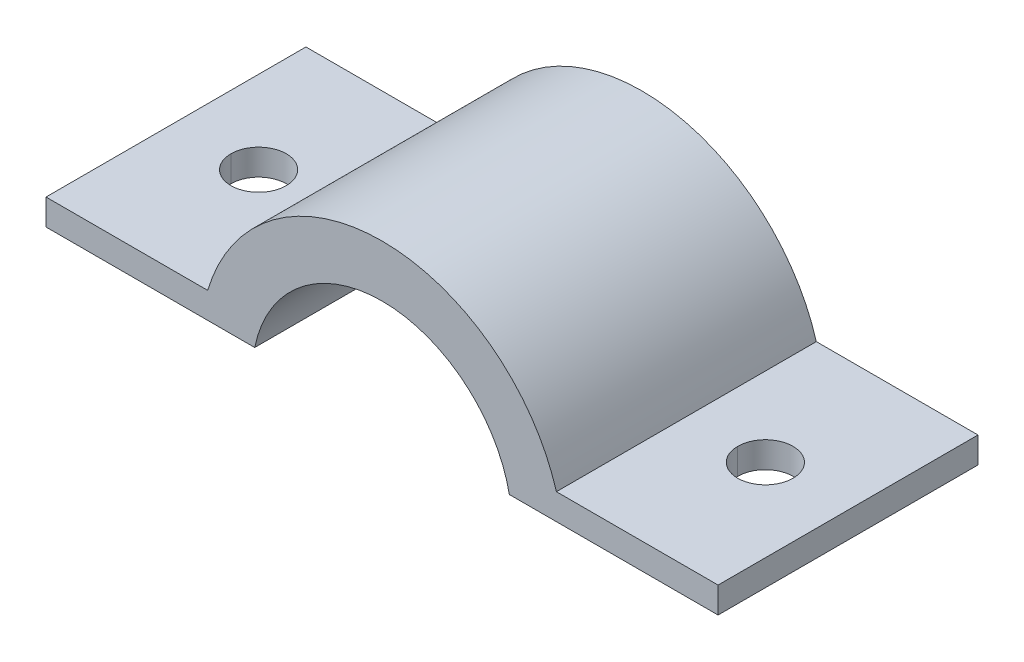
ISO-10303-21;
HEADER;
FILE_DESCRIPTION(('STEP AP214'),'2;1');
FILE_NAME('part.step','',(''),(''),'','','');
FILE_SCHEMA(('AUTOMOTIVE_DESIGN { 1 0 10303 214 1 1 1 1 }'));
ENDSEC;
DATA;
#1=APPLICATION_CONTEXT('core data for automotive mechanical design processes');
#2=APPLICATION_PROTOCOL_DEFINITION('international standard','automotive_design',2000,#1);
#3=PRODUCT_CONTEXT('',#1,'mechanical');
#4=PRODUCT('Part','Part','',(#3));
#5=PRODUCT_RELATED_PRODUCT_CATEGORY('part','',(#4));
#6=PRODUCT_DEFINITION_FORMATION('','',#4);
#7=PRODUCT_DEFINITION_CONTEXT('part definition',#1,'design');
#8=PRODUCT_DEFINITION('design','',#6,#7);
#9=PRODUCT_DEFINITION_SHAPE('','',#8);
#10=(LENGTH_UNIT() NAMED_UNIT(*) SI_UNIT(.MILLI.,.METRE.));
#11=(NAMED_UNIT(*) PLANE_ANGLE_UNIT() SI_UNIT($,.RADIAN.));
#12=(NAMED_UNIT(*) SI_UNIT($,.STERADIAN.) SOLID_ANGLE_UNIT());
#13=UNCERTAINTY_MEASURE_WITH_UNIT(LENGTH_MEASURE(1.E-05),#10,'distance_accuracy_value','');
#14=(GEOMETRIC_REPRESENTATION_CONTEXT(3) GLOBAL_UNCERTAINTY_ASSIGNED_CONTEXT((#13)) GLOBAL_UNIT_ASSIGNED_CONTEXT((#10,
#11,#12)) REPRESENTATION_CONTEXT('',''));
#15=CARTESIAN_POINT('',(0.,0.,0.));
#16=DIRECTION('',(0.,0.,1.));
#17=DIRECTION('',(1.,0.,0.));
#18=AXIS2_PLACEMENT_3D('',#15,#16,#17);
#19=CARTESIAN_POINT('',(30.9505474856748,-99.361625,0.));
#20=DIRECTION('',(0.,1.,0.));
#21=DIRECTION('',(-1.,0.,0.));
#22=AXIS2_PLACEMENT_3D('',#19,#20,#21);
#23=CYLINDRICAL_SURFACE('',#22,3.3782);
#24=CARTESIAN_POINT('',(30.9505474856748,127.,0.));
#25=DIRECTION('',(0.,1.,0.));
#26=DIRECTION('',(-1.,0.,0.));
#27=AXIS2_PLACEMENT_3D('',#24,#25,#26);
#28=CIRCLE('',#27,3.3782);
#29=CARTESIAN_POINT('',(27.5723474856748,127.,0.));
#30=VERTEX_POINT('',#29);
#31=CARTESIAN_POINT('',(34.3287474856748,127.,0.));
#32=VERTEX_POINT('',#31);
#33=EDGE_CURVE('E11',#30,#32,#28,.T.);
#34=ORIENTED_EDGE('',*,*,#33,.T.);
#35=DIRECTION('',(0.,-1.,0.));
#36=VECTOR('',#35,1.);
#37=CARTESIAN_POINT('',(34.3287474856748,127.,0.));
#38=LINE('',#37,#36);
#39=CARTESIAN_POINT('',(34.3287474856748,123.825,0.));
#40=VERTEX_POINT('',#39);
#41=EDGE_CURVE('E31',#32,#40,#38,.T.);
#42=ORIENTED_EDGE('',*,*,#41,.T.);
#43=CARTESIAN_POINT('',(30.9505474856748,123.825,0.));
#44=DIRECTION('',(0.,-1.,0.));
#45=DIRECTION('',(1.,0.,0.));
#46=AXIS2_PLACEMENT_3D('',#43,#44,#45);
#47=CIRCLE('',#46,3.3782);
#48=CARTESIAN_POINT('',(27.5723474856748,123.825,0.));
#49=VERTEX_POINT('',#48);
#50=EDGE_CURVE('E335',#40,#49,#47,.T.);
#51=ORIENTED_EDGE('',*,*,#50,.T.);
#52=DIRECTION('',(0.,-1.,0.));
#53=VECTOR('',#52,1.);
#54=CARTESIAN_POINT('',(27.5723474856748,127.,0.));
#55=LINE('',#54,#53);
#56=EDGE_CURVE('E392',#30,#49,#55,.T.);
#57=ORIENTED_EDGE('',*,*,#56,.F.);
#58=EDGE_LOOP('',(#34,#42,#51,#57));
#59=FACE_BOUND('',#58,.T.);
#60=ADVANCED_FACE('F17',(#59),#23,.F.);
#61=CARTESIAN_POINT('',(21.2985474856849,127.,15.875));
#62=DIRECTION('',(0.,-1.,0.));
#63=DIRECTION('',(1.,0.,0.));
#64=AXIS2_PLACEMENT_3D('',#61,#62,#63);
#65=PLANE('',#64);
#66=ORIENTED_EDGE('',*,*,#33,.F.);
#67=CARTESIAN_POINT('',(30.9505474856748,127.,0.));
#68=DIRECTION('',(0.,1.,0.));
#69=DIRECTION('',(1.,0.,0.));
#70=AXIS2_PLACEMENT_3D('',#67,#68,#69);
#71=CIRCLE('',#70,3.3782);
#72=EDGE_CURVE('E367',#32,#30,#71,.T.);
#73=ORIENTED_EDGE('',*,*,#72,.F.);
#74=EDGE_LOOP('',(#66,#73));
#75=FACE_BOUND('',#74,.T.);
#76=DIRECTION('',(0.,0.,1.));
#77=VECTOR('',#76,1.);
#78=CARTESIAN_POINT('',(41.0470452561136,127.,-15.875));
#79=LINE('',#78,#77);
#80=CARTESIAN_POINT('',(41.0470452561136,127.,-15.875));
#81=VERTEX_POINT('',#80);
#82=CARTESIAN_POINT('',(41.0470452561136,127.,15.875));
#83=VERTEX_POINT('',#82);
#84=EDGE_CURVE('E250',#81,#83,#79,.T.);
#85=ORIENTED_EDGE('',*,*,#84,.F.);
#86=DIRECTION('',(-1.,0.,0.));
#87=VECTOR('',#86,1.);
#88=CARTESIAN_POINT('',(41.0470452561136,127.,-15.875));
#89=LINE('',#88,#87);
#90=CARTESIAN_POINT('',(21.2985474856855,127.,-15.875));
#91=VERTEX_POINT('',#90);
#92=EDGE_CURVE('E396',#81,#91,#89,.T.);
#93=ORIENTED_EDGE('',*,*,#92,.T.);
#94=DIRECTION('',(0.,0.,1.));
#95=VECTOR('',#94,1.);
#96=CARTESIAN_POINT('',(21.2985474856854,127.,-15.875));
#97=LINE('',#96,#95);
#98=CARTESIAN_POINT('',(21.2985474856853,127.,15.875));
#99=VERTEX_POINT('',#98);
#100=EDGE_CURVE('E393',#91,#99,#97,.T.);
#101=ORIENTED_EDGE('',*,*,#100,.T.);
#102=DIRECTION('',(-1.,0.,0.));
#103=VECTOR('',#102,1.);
#104=CARTESIAN_POINT('',(41.0470452561136,127.,15.875));
#105=LINE('',#104,#103);
#106=EDGE_CURVE('E218',#83,#99,#105,.T.);
#107=ORIENTED_EDGE('',*,*,#106,.F.);
#108=EDGE_LOOP('',(#85,#93,#101,#107));
#109=FACE_BOUND('',#108,.T.);
#110=ADVANCED_FACE('F314',(#75,#109),#65,.F.);
#111=CARTESIAN_POINT('',(30.9505474856748,-99.361625,0.));
#112=DIRECTION('',(0.,1.,0.));
#113=DIRECTION('',(-1.,0.,0.));
#114=AXIS2_PLACEMENT_3D('',#111,#112,#113);
#115=CYLINDRICAL_SURFACE('',#114,3.3782);
#116=CARTESIAN_POINT('',(30.9505474856748,123.825,0.));
#117=DIRECTION('',(0.,-1.,0.));
#118=DIRECTION('',(-1.,0.,0.));
#119=AXIS2_PLACEMENT_3D('',#116,#117,#118);
#120=CIRCLE('',#119,3.3782);
#121=EDGE_CURVE('E203',#49,#40,#120,.T.);
#122=ORIENTED_EDGE('',*,*,#121,.T.);
#123=ORIENTED_EDGE('',*,*,#41,.F.);
#124=ORIENTED_EDGE('',*,*,#72,.T.);
#125=ORIENTED_EDGE('',*,*,#56,.T.);
#126=EDGE_LOOP('',(#122,#123,#124,#125));
#127=FACE_BOUND('',#126,.T.);
#128=ADVANCED_FACE('F352',(#127),#115,.F.);
#129=CARTESIAN_POINT('',(12.7,123.825,15.875));
#130=DIRECTION('',(0.,-1.,0.));
#131=DIRECTION('',(1.,0.,0.));
#132=AXIS2_PLACEMENT_3D('',#129,#130,#131);
#133=PLANE('',#132);
#134=ORIENTED_EDGE('',*,*,#50,.F.);
#135=ORIENTED_EDGE('',*,*,#121,.F.);
#136=EDGE_LOOP('',(#134,#135));
#137=FACE_BOUND('',#136,.T.);
#138=DIRECTION('',(0.,0.,-1.));
#139=VECTOR('',#138,1.);
#140=CARTESIAN_POINT('',(15.5542598666732,123.825,15.875));
#141=LINE('',#140,#139);
#142=CARTESIAN_POINT('',(15.5543038022376,123.825,15.875));
#143=VERTEX_POINT('',#142);
#144=CARTESIAN_POINT('',(15.5542598666732,123.825,-15.875));
#145=VERTEX_POINT('',#144);
#146=EDGE_CURVE('E210',#143,#145,#141,.T.);
#147=ORIENTED_EDGE('',*,*,#146,.T.);
#148=DIRECTION('',(1.,0.,0.));
#149=VECTOR('',#148,1.);
#150=CARTESIAN_POINT('',(15.5542598666731,123.825,-15.875));
#151=LINE('',#150,#149);
#152=CARTESIAN_POINT('',(41.0470452561136,123.825,-15.875));
#153=VERTEX_POINT('',#152);
#154=EDGE_CURVE('E206',#145,#153,#151,.T.);
#155=ORIENTED_EDGE('',*,*,#154,.T.);
#156=DIRECTION('',(0.,0.,1.));
#157=VECTOR('',#156,1.);
#158=CARTESIAN_POINT('',(41.0470452561136,123.825,-15.875));
#159=LINE('',#158,#157);
#160=CARTESIAN_POINT('',(41.0470452561136,123.825,15.875));
#161=VERTEX_POINT('',#160);
#162=EDGE_CURVE('E211',#153,#161,#159,.T.);
#163=ORIENTED_EDGE('',*,*,#162,.T.);
#164=DIRECTION('',(-1.,0.,0.));
#165=VECTOR('',#164,1.);
#166=CARTESIAN_POINT('',(41.0470452561136,123.825,15.875));
#167=LINE('',#166,#165);
#168=EDGE_CURVE('E750',#161,#143,#167,.T.);
#169=ORIENTED_EDGE('',*,*,#168,.T.);
#170=EDGE_LOOP('',(#147,#155,#163,#169));
#171=FACE_BOUND('',#170,.T.);
#172=ADVANCED_FACE('F341',(#137,#171),#133,.T.);
#173=CARTESIAN_POINT('',(41.0470452561136,127.,15.875));
#174=DIRECTION('',(-1.,0.,0.));
#175=DIRECTION('',(0.,-1.,0.));
#176=AXIS2_PLACEMENT_3D('',#173,#174,#175);
#177=PLANE('',#176);
#178=ORIENTED_EDGE('',*,*,#162,.F.);
#179=DIRECTION('',(0.,1.,0.));
#180=VECTOR('',#179,1.);
#181=CARTESIAN_POINT('',(41.0470452561136,123.825,-15.875));
#182=LINE('',#181,#180);
#183=EDGE_CURVE('E748',#153,#81,#182,.T.);
#184=ORIENTED_EDGE('',*,*,#183,.T.);
#185=ORIENTED_EDGE('',*,*,#84,.T.);
#186=DIRECTION('',(0.,1.,0.));
#187=VECTOR('',#186,1.);
#188=CARTESIAN_POINT('',(41.0470452561136,123.825,15.875));
#189=LINE('',#188,#187);
#190=EDGE_CURVE('E213',#161,#83,#189,.T.);
#191=ORIENTED_EDGE('',*,*,#190,.F.);
#192=EDGE_LOOP('',(#178,#184,#185,#191));
#193=FACE_BOUND('',#192,.T.);
#194=ADVANCED_FACE('F351',(#193),#177,.F.);
#195=CARTESIAN_POINT('',(0.,0.,-15.875));
#196=DIRECTION('',(0.,0.,1.));
#197=DIRECTION('',(0.,-1.,0.));
#198=AXIS2_PLACEMENT_3D('',#195,#196,#197);
#199=PLANE('',#198);
#200=CARTESIAN_POINT('',(0.,120.65,-15.875));
#201=DIRECTION('',(0.,0.,-1.));
#202=DIRECTION('',(0.,1.,0.));
#203=AXIS2_PLACEMENT_3D('',#200,#201,#202);
#204=CIRCLE('',#203,15.875);
#205=CARTESIAN_POINT('',(0.,136.525,-15.875));
#206=VERTEX_POINT('',#205);
#207=EDGE_CURVE('E220',#206,#145,#204,.T.);
#208=ORIENTED_EDGE('',*,*,#207,.F.);
#209=CARTESIAN_POINT('',(0.,120.65,-15.875));
#210=DIRECTION('',(0.,0.,-1.));
#211=DIRECTION('',(-0.979796007810995,0.199999457693358,0.));
#212=AXIS2_PLACEMENT_3D('',#209,#210,#211);
#213=CIRCLE('',#212,15.875);
#214=CARTESIAN_POINT('',(-15.5543038022376,123.825,-15.875));
#215=VERTEX_POINT('',#214);
#216=EDGE_CURVE('E224',#215,#206,#213,.T.);
#217=ORIENTED_EDGE('',*,*,#216,.F.);
#218=DIRECTION('',(1.,0.,0.));
#219=VECTOR('',#218,1.);
#220=CARTESIAN_POINT('',(-41.0470452561136,123.825,-15.875));
#221=LINE('',#220,#219);
#222=CARTESIAN_POINT('',(-41.0470452561136,123.825,-15.875));
#223=VERTEX_POINT('',#222);
#224=EDGE_CURVE('E230',#223,#215,#221,.T.);
#225=ORIENTED_EDGE('',*,*,#224,.F.);
#226=DIRECTION('',(0.,1.,0.));
#227=VECTOR('',#226,1.);
#228=CARTESIAN_POINT('',(-41.0470452561136,123.825,-15.875));
#229=LINE('',#228,#227);
#230=CARTESIAN_POINT('',(-41.0470452561136,127.,-15.875));
#231=VERTEX_POINT('',#230);
#232=EDGE_CURVE('E246',#223,#231,#229,.T.);
#233=ORIENTED_EDGE('',*,*,#232,.T.);
#234=DIRECTION('',(1.,0.,0.));
#235=VECTOR('',#234,1.);
#236=CARTESIAN_POINT('',(-41.0470452561136,127.,-15.875));
#237=LINE('',#236,#235);
#238=CARTESIAN_POINT('',(-21.2985474856853,127.,-15.875));
#239=VERTEX_POINT('',#238);
#240=EDGE_CURVE('E251',#231,#239,#237,.T.);
#241=ORIENTED_EDGE('',*,*,#240,.T.);
#242=CARTESIAN_POINT('',(0.,120.65,-15.875));
#243=DIRECTION('',(0.,0.,1.));
#244=DIRECTION('',(0.,1.,0.));
#245=AXIS2_PLACEMENT_3D('',#242,#243,#244);
#246=CIRCLE('',#245,22.225);
#247=CARTESIAN_POINT('',(0.,142.875,-15.875));
#248=VERTEX_POINT('',#247);
#249=EDGE_CURVE('E241',#248,#239,#246,.T.);
#250=ORIENTED_EDGE('',*,*,#249,.F.);
#251=CARTESIAN_POINT('',(0.,120.65,-15.875));
#252=DIRECTION('',(0.,0.,1.));
#253=DIRECTION('',(0.958314847499909,0.285714285714287,0.));
#254=AXIS2_PLACEMENT_3D('',#251,#252,#253);
#255=CIRCLE('',#254,22.225);
#256=EDGE_CURVE('E244',#91,#248,#255,.T.);
#257=ORIENTED_EDGE('',*,*,#256,.F.);
#258=ORIENTED_EDGE('',*,*,#92,.F.);
#259=ORIENTED_EDGE('',*,*,#183,.F.);
#260=ORIENTED_EDGE('',*,*,#154,.F.);
#261=EDGE_LOOP('',(#208,#217,#225,#233,#241,#250,#257,#258,#259,#260));
#262=FACE_BOUND('',#261,.T.);
#263=ADVANCED_FACE('F445',(#262),#199,.F.);
#264=CARTESIAN_POINT('',(0.,120.65,-15.875));
#265=DIRECTION('',(0.,0.,-1.));
#266=DIRECTION('',(0.,-1.,0.));
#267=AXIS2_PLACEMENT_3D('',#264,#265,#266);
#268=CYLINDRICAL_SURFACE('',#267,22.225);
#269=ORIENTED_EDGE('',*,*,#256,.T.);
#270=ORIENTED_EDGE('',*,*,#249,.T.);
#271=DIRECTION('',(0.,0.,-1.));
#272=VECTOR('',#271,1.);
#273=CARTESIAN_POINT('',(-21.2985474856854,127.,15.875));
#274=LINE('',#273,#272);
#275=CARTESIAN_POINT('',(-21.2985474856855,127.,15.875));
#276=VERTEX_POINT('',#275);
#277=EDGE_CURVE('E140',#276,#239,#274,.T.);
#278=ORIENTED_EDGE('',*,*,#277,.F.);
#279=CARTESIAN_POINT('',(0.,120.65,15.875));
#280=DIRECTION('',(0.,0.,-1.));
#281=DIRECTION('',(-0.95831484749991,0.285714285714286,0.));
#282=AXIS2_PLACEMENT_3D('',#279,#280,#281);
#283=CIRCLE('',#282,22.225);
#284=CARTESIAN_POINT('',(0.,142.875,15.875));
#285=VERTEX_POINT('',#284);
#286=EDGE_CURVE('E245',#276,#285,#283,.T.);
#287=ORIENTED_EDGE('',*,*,#286,.T.);
#288=CARTESIAN_POINT('',(0.,120.65,15.875));
#289=DIRECTION('',(0.,0.,-1.));
#290=DIRECTION('',(0.,1.,0.));
#291=AXIS2_PLACEMENT_3D('',#288,#289,#290);
#292=CIRCLE('',#291,22.225);
#293=EDGE_CURVE('E217',#285,#99,#292,.T.);
#294=ORIENTED_EDGE('',*,*,#293,.T.);
#295=ORIENTED_EDGE('',*,*,#100,.F.);
#296=EDGE_LOOP('',(#269,#270,#278,#287,#294,#295));
#297=FACE_BOUND('',#296,.T.);
#298=ADVANCED_FACE('F174',(#297),#268,.T.);
#299=CARTESIAN_POINT('',(0.,0.,15.875));
#300=DIRECTION('',(0.,0.,1.));
#301=DIRECTION('',(0.,-1.,0.));
#302=AXIS2_PLACEMENT_3D('',#299,#300,#301);
#303=PLANE('',#302);
#304=DIRECTION('',(1.,0.,0.));
#305=VECTOR('',#304,1.);
#306=CARTESIAN_POINT('',(-41.0470452561136,127.,15.875));
#307=LINE('',#306,#305);
#308=CARTESIAN_POINT('',(-41.0470452561136,127.,15.875));
#309=VERTEX_POINT('',#308);
#310=EDGE_CURVE('E253',#309,#276,#307,.T.);
#311=ORIENTED_EDGE('',*,*,#310,.F.);
#312=DIRECTION('',(0.,1.,0.));
#313=VECTOR('',#312,1.);
#314=CARTESIAN_POINT('',(-41.0470452561136,123.825,15.875));
#315=LINE('',#314,#313);
#316=CARTESIAN_POINT('',(-41.0470452561136,123.825,15.875));
#317=VERTEX_POINT('',#316);
#318=EDGE_CURVE('E231',#317,#309,#315,.T.);
#319=ORIENTED_EDGE('',*,*,#318,.F.);
#320=DIRECTION('',(-1.,0.,0.));
#321=VECTOR('',#320,1.);
#322=CARTESIAN_POINT('',(-15.5542598666731,123.825,15.875));
#323=LINE('',#322,#321);
#324=CARTESIAN_POINT('',(-15.5542598666732,123.825,15.875));
#325=VERTEX_POINT('',#324);
#326=EDGE_CURVE('E239',#325,#317,#323,.T.);
#327=ORIENTED_EDGE('',*,*,#326,.F.);
#328=CARTESIAN_POINT('',(0.,120.65,15.875));
#329=DIRECTION('',(0.,0.,1.));
#330=DIRECTION('',(0.,1.,0.));
#331=AXIS2_PLACEMENT_3D('',#328,#329,#330);
#332=CIRCLE('',#331,15.875);
#333=CARTESIAN_POINT('',(0.,136.525,15.875));
#334=VERTEX_POINT('',#333);
#335=EDGE_CURVE('E236',#334,#325,#332,.T.);
#336=ORIENTED_EDGE('',*,*,#335,.F.);
#337=CARTESIAN_POINT('',(0.,120.65,15.875));
#338=DIRECTION('',(0.,0.,1.));
#339=DIRECTION('',(0.979796007810995,0.199999457693355,0.));
#340=AXIS2_PLACEMENT_3D('',#337,#338,#339);
#341=CIRCLE('',#340,15.875);
#342=EDGE_CURVE('E283',#143,#334,#341,.T.);
#343=ORIENTED_EDGE('',*,*,#342,.F.);
#344=ORIENTED_EDGE('',*,*,#168,.F.);
#345=ORIENTED_EDGE('',*,*,#190,.T.);
#346=ORIENTED_EDGE('',*,*,#106,.T.);
#347=ORIENTED_EDGE('',*,*,#293,.F.);
#348=ORIENTED_EDGE('',*,*,#286,.F.);
#349=EDGE_LOOP('',(#311,#319,#327,#336,#343,#344,#345,#346,#347,#348));
#350=FACE_BOUND('',#349,.T.);
#351=ADVANCED_FACE('F453',(#350),#303,.T.);
#352=CARTESIAN_POINT('',(0.,120.65,-15.875));
#353=DIRECTION('',(0.,0.,-1.));
#354=DIRECTION('',(0.,-1.,0.));
#355=AXIS2_PLACEMENT_3D('',#352,#353,#354);
#356=CYLINDRICAL_SURFACE('',#355,15.875);
#357=ORIENTED_EDGE('',*,*,#342,.T.);
#358=ORIENTED_EDGE('',*,*,#335,.T.);
#359=DIRECTION('',(0.,0.,1.));
#360=VECTOR('',#359,1.);
#361=CARTESIAN_POINT('',(-15.5542598666732,123.825,-15.875));
#362=LINE('',#361,#360);
#363=EDGE_CURVE('E225',#215,#325,#362,.T.);
#364=ORIENTED_EDGE('',*,*,#363,.F.);
#365=ORIENTED_EDGE('',*,*,#216,.T.);
#366=ORIENTED_EDGE('',*,*,#207,.T.);
#367=ORIENTED_EDGE('',*,*,#146,.F.);
#368=EDGE_LOOP('',(#357,#358,#364,#365,#366,#367));
#369=FACE_BOUND('',#368,.T.);
#370=ADVANCED_FACE('F315',(#369),#356,.F.);
#371=CARTESIAN_POINT('',(-12.7,123.825,15.875));
#372=DIRECTION('',(0.,1.,0.));
#373=DIRECTION('',(-1.,0.,0.));
#374=AXIS2_PLACEMENT_3D('',#371,#372,#373);
#375=PLANE('',#374);
#376=CARTESIAN_POINT('',(-30.9505474856748,123.825,0.));
#377=DIRECTION('',(0.,-1.,0.));
#378=DIRECTION('',(1.,0.,0.));
#379=AXIS2_PLACEMENT_3D('',#376,#377,#378);
#380=CIRCLE('',#379,3.3782);
#381=CARTESIAN_POINT('',(-27.5723474856748,123.825,0.));
#382=VERTEX_POINT('',#381);
#383=CARTESIAN_POINT('',(-34.3287474856748,123.825,0.));
#384=VERTEX_POINT('',#383);
#385=EDGE_CURVE('E129',#382,#384,#380,.T.);
#386=ORIENTED_EDGE('',*,*,#385,.F.);
#387=CARTESIAN_POINT('',(-30.9505474856748,123.825,0.));
#388=DIRECTION('',(0.,-1.,0.));
#389=DIRECTION('',(-1.,0.,0.));
#390=AXIS2_PLACEMENT_3D('',#387,#388,#389);
#391=CIRCLE('',#390,3.3782);
#392=EDGE_CURVE('E144',#384,#382,#391,.T.);
#393=ORIENTED_EDGE('',*,*,#392,.F.);
#394=EDGE_LOOP('',(#386,#393));
#395=FACE_BOUND('',#394,.T.);
#396=ORIENTED_EDGE('',*,*,#363,.T.);
#397=ORIENTED_EDGE('',*,*,#326,.T.);
#398=DIRECTION('',(0.,0.,1.));
#399=VECTOR('',#398,1.);
#400=CARTESIAN_POINT('',(-41.0470452561136,123.825,-15.875));
#401=LINE('',#400,#399);
#402=EDGE_CURVE('E226',#223,#317,#401,.T.);
#403=ORIENTED_EDGE('',*,*,#402,.F.);
#404=ORIENTED_EDGE('',*,*,#224,.T.);
#405=EDGE_LOOP('',(#396,#397,#403,#404));
#406=FACE_BOUND('',#405,.T.);
#407=ADVANCED_FACE('F177',(#395,#406),#375,.F.);
#408=CARTESIAN_POINT('',(-41.0470452561136,127.,15.875));
#409=DIRECTION('',(-1.,0.,0.));
#410=DIRECTION('',(0.,-1.,0.));
#411=AXIS2_PLACEMENT_3D('',#408,#409,#410);
#412=PLANE('',#411);
#413=DIRECTION('',(0.,0.,1.));
#414=VECTOR('',#413,1.);
#415=CARTESIAN_POINT('',(-41.0470452561136,127.,-15.875));
#416=LINE('',#415,#414);
#417=EDGE_CURVE('E257',#231,#309,#416,.T.);
#418=ORIENTED_EDGE('',*,*,#417,.F.);
#419=ORIENTED_EDGE('',*,*,#232,.F.);
#420=ORIENTED_EDGE('',*,*,#402,.T.);
#421=ORIENTED_EDGE('',*,*,#318,.T.);
#422=EDGE_LOOP('',(#418,#419,#420,#421));
#423=FACE_BOUND('',#422,.T.);
#424=ADVANCED_FACE('F598',(#423),#412,.T.);
#425=CARTESIAN_POINT('',(-21.2985474856849,127.,15.875));
#426=DIRECTION('',(0.,1.,0.));
#427=DIRECTION('',(-1.,0.,0.));
#428=AXIS2_PLACEMENT_3D('',#425,#426,#427);
#429=PLANE('',#428);
#430=CARTESIAN_POINT('',(-30.9505474856748,127.,0.));
#431=DIRECTION('',(0.,1.,0.));
#432=DIRECTION('',(-1.,0.,0.));
#433=AXIS2_PLACEMENT_3D('',#430,#431,#432);
#434=CIRCLE('',#433,3.3782);
#435=CARTESIAN_POINT('',(-34.3287474856748,127.,0.));
#436=VERTEX_POINT('',#435);
#437=CARTESIAN_POINT('',(-27.5723474856748,127.,0.));
#438=VERTEX_POINT('',#437);
#439=EDGE_CURVE('E125',#436,#438,#434,.T.);
#440=ORIENTED_EDGE('',*,*,#439,.F.);
#441=CARTESIAN_POINT('',(-30.9505474856748,127.,0.));
#442=DIRECTION('',(0.,1.,0.));
#443=DIRECTION('',(1.,0.,0.));
#444=AXIS2_PLACEMENT_3D('',#441,#442,#443);
#445=CIRCLE('',#444,3.3782);
#446=EDGE_CURVE('E118',#438,#436,#445,.T.);
#447=ORIENTED_EDGE('',*,*,#446,.F.);
#448=EDGE_LOOP('',(#440,#447));
#449=FACE_BOUND('',#448,.T.);
#450=ORIENTED_EDGE('',*,*,#240,.F.);
#451=ORIENTED_EDGE('',*,*,#417,.T.);
#452=ORIENTED_EDGE('',*,*,#310,.T.);
#453=ORIENTED_EDGE('',*,*,#277,.T.);
#454=EDGE_LOOP('',(#450,#451,#452,#453));
#455=FACE_BOUND('',#454,.T.);
#456=ADVANCED_FACE('F19',(#449,#455),#429,.T.);
#457=CARTESIAN_POINT('',(-30.9505474856748,-99.361625,0.));
#458=DIRECTION('',(0.,-1.,0.));
#459=DIRECTION('',(1.,0.,0.));
#460=AXIS2_PLACEMENT_3D('',#457,#458,#459);
#461=CYLINDRICAL_SURFACE('',#460,3.3782);
#462=DIRECTION('',(0.,-1.,0.));
#463=VECTOR('',#462,1.);
#464=CARTESIAN_POINT('',(-34.3287474856748,127.,0.));
#465=LINE('',#464,#463);
#466=EDGE_CURVE('E130',#436,#384,#465,.T.);
#467=ORIENTED_EDGE('',*,*,#466,.F.);
#468=ORIENTED_EDGE('',*,*,#439,.T.);
#469=DIRECTION('',(0.,-1.,0.));
#470=VECTOR('',#469,1.);
#471=CARTESIAN_POINT('',(-27.5723474856748,127.,0.));
#472=LINE('',#471,#470);
#473=EDGE_CURVE('E138',#438,#382,#472,.T.);
#474=ORIENTED_EDGE('',*,*,#473,.T.);
#475=ORIENTED_EDGE('',*,*,#385,.T.);
#476=EDGE_LOOP('',(#467,#468,#474,#475));
#477=FACE_BOUND('',#476,.T.);
#478=ADVANCED_FACE('F136',(#477),#461,.F.);
#479=CARTESIAN_POINT('',(-30.9505474856748,-99.361625,0.));
#480=DIRECTION('',(0.,-1.,0.));
#481=DIRECTION('',(1.,0.,0.));
#482=AXIS2_PLACEMENT_3D('',#479,#480,#481);
#483=CYLINDRICAL_SURFACE('',#482,3.3782);
#484=ORIENTED_EDGE('',*,*,#473,.F.);
#485=ORIENTED_EDGE('',*,*,#446,.T.);
#486=ORIENTED_EDGE('',*,*,#466,.T.);
#487=ORIENTED_EDGE('',*,*,#392,.T.);
#488=EDGE_LOOP('',(#484,#485,#486,#487));
#489=FACE_BOUND('',#488,.T.);
#490=ADVANCED_FACE('F143',(#489),#483,.F.);
#491=CLOSED_SHELL('',(#60,#110,#128,#172,#194,#263,#298,#351,#370,#407,#424,#456,#478,#490));
#492=MANIFOLD_SOLID_BREP('B1',#491);
#493=ADVANCED_BREP_SHAPE_REPRESENTATION('',(#18,#492),#14);
#494=SHAPE_DEFINITION_REPRESENTATION(#9,#493);
ENDSEC;
END-ISO-10303-21;
